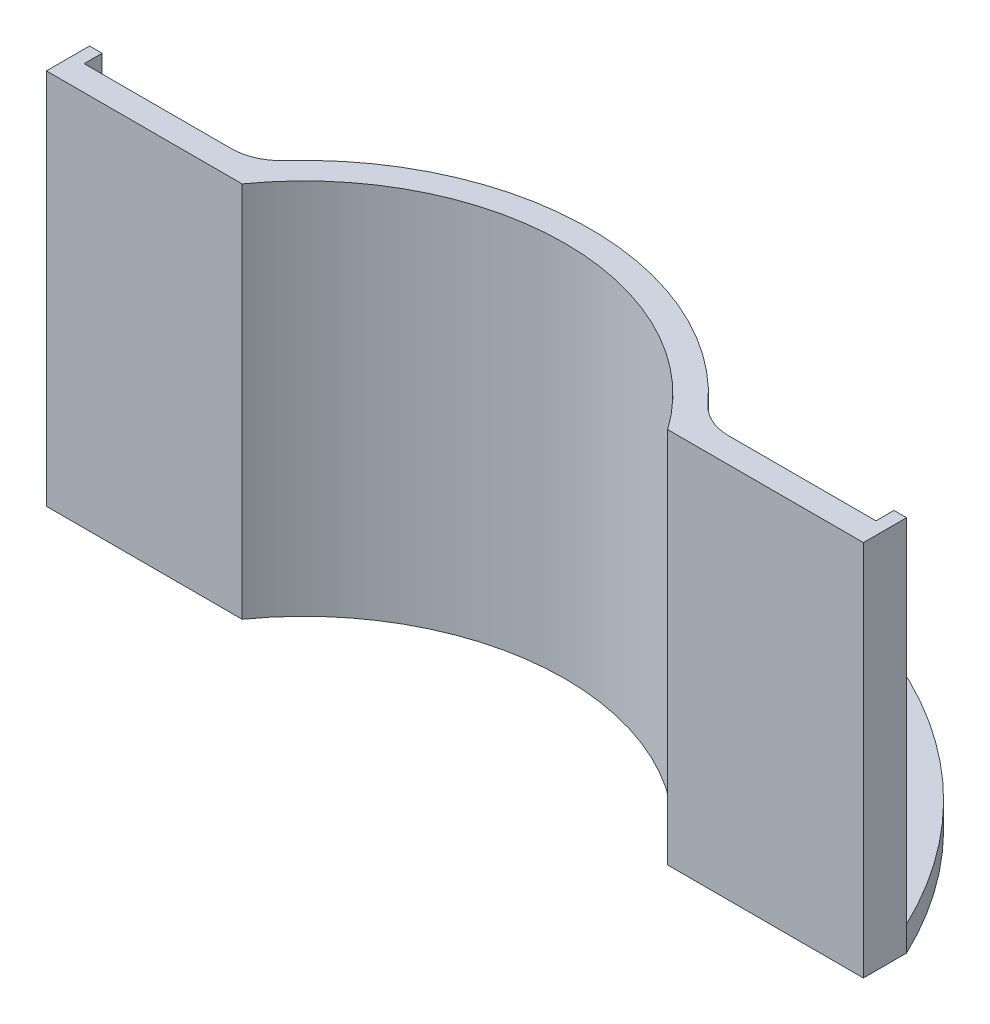
ISO-10303-21;
HEADER;
FILE_DESCRIPTION(('STEP AP214'),'2;1');
FILE_NAME('part.step','',(''),(''),'','','');
FILE_SCHEMA(('AUTOMOTIVE_DESIGN { 1 0 10303 214 1 1 1 1 }'));
ENDSEC;
DATA;
#1=APPLICATION_CONTEXT('core data for automotive mechanical design processes');
#2=APPLICATION_PROTOCOL_DEFINITION('international standard','automotive_design',2000,#1);
#3=PRODUCT_CONTEXT('',#1,'mechanical');
#4=PRODUCT('Part','Part','',(#3));
#5=PRODUCT_RELATED_PRODUCT_CATEGORY('part','',(#4));
#6=PRODUCT_DEFINITION_FORMATION('','',#4);
#7=PRODUCT_DEFINITION_CONTEXT('part definition',#1,'design');
#8=PRODUCT_DEFINITION('design','',#6,#7);
#9=PRODUCT_DEFINITION_SHAPE('','',#8);
#10=(LENGTH_UNIT() NAMED_UNIT(*) SI_UNIT(.MILLI.,.METRE.));
#11=(NAMED_UNIT(*) PLANE_ANGLE_UNIT() SI_UNIT($,.RADIAN.));
#12=(NAMED_UNIT(*) SI_UNIT($,.STERADIAN.) SOLID_ANGLE_UNIT());
#13=UNCERTAINTY_MEASURE_WITH_UNIT(LENGTH_MEASURE(1.E-05),#10,'distance_accuracy_value','');
#14=(GEOMETRIC_REPRESENTATION_CONTEXT(3) GLOBAL_UNCERTAINTY_ASSIGNED_CONTEXT((#13)) GLOBAL_UNIT_ASSIGNED_CONTEXT((#10,
#11,#12)) REPRESENTATION_CONTEXT('',''));
#15=CARTESIAN_POINT('',(0.,0.,0.));
#16=DIRECTION('',(0.,0.,1.));
#17=DIRECTION('',(1.,0.,0.));
#18=AXIS2_PLACEMENT_3D('',#15,#16,#17);
#19=CARTESIAN_POINT('',(0.,38.1,0.));
#20=DIRECTION('',(0.,1.,0.));
#21=DIRECTION('',(0.,0.,1.));
#22=AXIS2_PLACEMENT_3D('',#19,#20,#21);
#23=PLANE('',#22);
#24=DIRECTION('',(0.,0.,1.));
#25=VECTOR('',#24,1.);
#26=CARTESIAN_POINT('',(-40.005,38.1,12.0650000000002));
#27=LINE('',#26,#25);
#28=CARTESIAN_POINT('',(-40.005,38.1,10.2461896076332));
#29=VERTEX_POINT('',#28);
#30=CARTESIAN_POINT('',(-40.005,38.1,12.0650000000002));
#31=VERTEX_POINT('',#30);
#32=EDGE_CURVE('E320',#29,#31,#27,.T.);
#33=ORIENTED_EDGE('',*,*,#32,.F.);
#34=DIRECTION('',(1.,0.,0.));
#35=VECTOR('',#34,1.);
#36=CARTESIAN_POINT('',(-41.275,38.1,10.2461896076332));
#37=LINE('',#36,#35);
#38=CARTESIAN_POINT('',(-41.275,38.1,10.2461896076332));
#39=VERTEX_POINT('',#38);
#40=EDGE_CURVE('E150',#39,#29,#37,.T.);
#41=ORIENTED_EDGE('',*,*,#40,.F.);
#42=DIRECTION('',(0.,0.,1.));
#43=VECTOR('',#42,1.);
#44=CARTESIAN_POINT('',(-41.275,38.1,14.605));
#45=LINE('',#44,#43);
#46=CARTESIAN_POINT('',(-41.275,38.1,14.605));
#47=VERTEX_POINT('',#46);
#48=EDGE_CURVE('E144',#39,#47,#45,.T.);
#49=ORIENTED_EDGE('',*,*,#48,.T.);
#50=DIRECTION('',(1.,0.,0.));
#51=VECTOR('',#50,1.);
#52=CARTESIAN_POINT('',(41.275,38.1,14.605));
#53=LINE('',#52,#51);
#54=CARTESIAN_POINT('',(-21.498759411882,38.1,14.605));
#55=VERTEX_POINT('',#54);
#56=EDGE_CURVE('E147',#47,#55,#53,.T.);
#57=ORIENTED_EDGE('',*,*,#56,.T.);
#58=CARTESIAN_POINT('',(3.89345260586563E-13,38.1,29.845));
#59=DIRECTION('',(0.,1.,0.));
#60=DIRECTION('',(0.,0.,1.));
#61=AXIS2_PLACEMENT_3D('',#58,#59,#60);
#62=CIRCLE('',#61,26.3524999999997);
#63=CARTESIAN_POINT('',(21.498759411882,38.1,14.605));
#64=VERTEX_POINT('',#63);
#65=EDGE_CURVE('E202',#64,#55,#62,.T.);
#66=ORIENTED_EDGE('',*,*,#65,.F.);
#67=CARTESIAN_POINT('',(41.275,38.1,14.605));
#68=VERTEX_POINT('',#67);
#69=EDGE_CURVE('E165',#64,#68,#53,.T.);
#70=ORIENTED_EDGE('',*,*,#69,.T.);
#71=DIRECTION('',(0.,0.,-1.));
#72=VECTOR('',#71,1.);
#73=CARTESIAN_POINT('',(41.275,38.1,14.605));
#74=LINE('',#73,#72);
#75=CARTESIAN_POINT('',(41.275,38.1,10.2461896076315));
#76=VERTEX_POINT('',#75);
#77=EDGE_CURVE('E154',#68,#76,#74,.T.);
#78=ORIENTED_EDGE('',*,*,#77,.T.);
#79=DIRECTION('',(1.,0.,-1.32494627692717E-12));
#80=VECTOR('',#79,1.);
#81=CARTESIAN_POINT('',(41.275,38.1,10.2461896076315));
#82=LINE('',#81,#80);
#83=CARTESIAN_POINT('',(40.005,38.1,10.2461896076332));
#84=VERTEX_POINT('',#83);
#85=EDGE_CURVE('E298',#84,#76,#82,.T.);
#86=ORIENTED_EDGE('',*,*,#85,.F.);
#87=DIRECTION('',(0.,0.,-1.));
#88=VECTOR('',#87,1.);
#89=CARTESIAN_POINT('',(40.005,38.1,10.2461896076332));
#90=LINE('',#89,#88);
#91=CARTESIAN_POINT('',(40.005,38.1,12.0649999999997));
#92=VERTEX_POINT('',#91);
#93=EDGE_CURVE('E303',#92,#84,#90,.T.);
#94=ORIENTED_EDGE('',*,*,#93,.F.);
#95=DIRECTION('',(-1.,0.,0.));
#96=VECTOR('',#95,1.);
#97=CARTESIAN_POINT('',(2.69374875231912E-13,38.1,12.065));
#98=LINE('',#97,#96);
#99=CARTESIAN_POINT('',(25.1306815715375,38.1,12.0649999999998));
#100=VERTEX_POINT('',#99);
#101=EDGE_CURVE('E79',#92,#100,#98,.T.);
#102=ORIENTED_EDGE('',*,*,#101,.T.);
#103=CARTESIAN_POINT('',(25.1306815715374,38.1,6.98499999999982));
#104=DIRECTION('',(0.,1.,0.));
#105=DIRECTION('',(0.,0.,-1.));
#106=AXIS2_PLACEMENT_3D('',#103,#104,#105);
#107=CIRCLE('',#106,5.08);
#108=CARTESIAN_POINT('',(21.3728226449525,38.1,10.4033177570092));
#109=VERTEX_POINT('',#108);
#110=EDGE_CURVE('E273',#109,#100,#107,.T.);
#111=ORIENTED_EDGE('',*,*,#110,.F.);
#112=CARTESIAN_POINT('',(3.9265862473015E-13,38.1,29.845));
#113=DIRECTION('',(0.,-1.,0.));
#114=DIRECTION('',(0.,0.,-1.));
#115=AXIS2_PLACEMENT_3D('',#112,#113,#114);
#116=CIRCLE('',#115,28.8925);
#117=CARTESIAN_POINT('',(-21.3728226449519,38.1,10.4033177570095));
#118=VERTEX_POINT('',#117);
#119=EDGE_CURVE('E251',#118,#109,#116,.T.);
#120=ORIENTED_EDGE('',*,*,#119,.F.);
#121=CARTESIAN_POINT('',(-25.130681571537,38.1,6.98500000000016));
#122=DIRECTION('',(0.,1.,0.));
#123=DIRECTION('',(0.,0.,-1.));
#124=AXIS2_PLACEMENT_3D('',#121,#122,#123);
#125=CIRCLE('',#124,5.08);
#126=CARTESIAN_POINT('',(-25.130681571537,38.1,12.0650000000002));
#127=VERTEX_POINT('',#126);
#128=EDGE_CURVE('E271',#127,#118,#125,.T.);
#129=ORIENTED_EDGE('',*,*,#128,.F.);
#130=EDGE_CURVE('E91',#127,#31,#98,.T.);
#131=ORIENTED_EDGE('',*,*,#130,.T.);
#132=EDGE_LOOP('',(#33,#41,#49,#57,#66,#70,#78,#86,#94,#102,#111,#120,#129,#131));
#133=FACE_BOUND('',#132,.T.);
#134=ADVANCED_FACE('F76',(#133),#23,.T.);
#135=CARTESIAN_POINT('',(41.275,38.1,-14.605));
#136=DIRECTION('',(0.,0.,1.));
#137=DIRECTION('',(1.,0.,0.));
#138=AXIS2_PLACEMENT_3D('',#135,#136,#137);
#139=PLANE('',#138);
#140=DIRECTION('',(-1.,0.,0.));
#141=VECTOR('',#140,1.);
#142=CARTESIAN_POINT('',(41.275,2.54,-14.605));
#143=LINE('',#142,#141);
#144=CARTESIAN_POINT('',(10.5800044327009,2.54,-14.6050000000002));
#145=VERTEX_POINT('',#144);
#146=CARTESIAN_POINT('',(-10.5800044327009,2.54,-14.605));
#147=VERTEX_POINT('',#146);
#148=EDGE_CURVE('E222',#145,#147,#143,.T.);
#149=ORIENTED_EDGE('',*,*,#148,.F.);
#150=DIRECTION('',(0.,1.,0.));
#151=VECTOR('',#150,1.);
#152=CARTESIAN_POINT('',(10.5800044327009,0.,-14.605));
#153=LINE('',#152,#151);
#154=CARTESIAN_POINT('',(10.5800044327009,0.,-14.605));
#155=VERTEX_POINT('',#154);
#156=EDGE_CURVE('E205',#155,#145,#153,.T.);
#157=ORIENTED_EDGE('',*,*,#156,.F.);
#158=DIRECTION('',(-1.,0.,0.));
#159=VECTOR('',#158,1.);
#160=CARTESIAN_POINT('',(41.275,0.,-14.605));
#161=LINE('',#160,#159);
#162=CARTESIAN_POINT('',(-10.5800044327009,0.,-14.605));
#163=VERTEX_POINT('',#162);
#164=EDGE_CURVE('E183',#155,#163,#161,.T.);
#165=ORIENTED_EDGE('',*,*,#164,.T.);
#166=DIRECTION('',(0.,1.,0.));
#167=VECTOR('',#166,1.);
#168=CARTESIAN_POINT('',(-10.5800044327009,0.,-14.605));
#169=LINE('',#168,#167);
#170=EDGE_CURVE('E186',#163,#147,#169,.T.);
#171=ORIENTED_EDGE('',*,*,#170,.T.);
#172=EDGE_LOOP('',(#149,#157,#165,#171));
#173=FACE_BOUND('',#172,.T.);
#174=ADVANCED_FACE('F220',(#173),#139,.F.);
#175=CARTESIAN_POINT('',(3.89345260586563E-13,0.,29.845));
#176=DIRECTION('',(0.,1.,0.));
#177=DIRECTION('',(0.,0.,1.));
#178=AXIS2_PLACEMENT_3D('',#175,#176,#177);
#179=CYLINDRICAL_SURFACE('',#178,45.6917825631259);
#180=DIRECTION('',(0.,1.,0.));
#181=VECTOR('',#180,1.);
#182=CARTESIAN_POINT('',(-41.275,0.,10.2461896076332));
#183=LINE('',#182,#181);
#184=CARTESIAN_POINT('',(-41.275,0.,10.2461896076332));
#185=VERTEX_POINT('',#184);
#186=CARTESIAN_POINT('',(-41.275,2.54,10.2461896076332));
#187=VERTEX_POINT('',#186);
#188=EDGE_CURVE('E197',#185,#187,#183,.T.);
#189=ORIENTED_EDGE('',*,*,#188,.T.);
#190=CARTESIAN_POINT('',(3.89345260586563E-13,2.54,29.845));
#191=DIRECTION('',(0.,1.,0.));
#192=DIRECTION('',(0.,0.,1.));
#193=AXIS2_PLACEMENT_3D('',#190,#191,#192);
#194=CIRCLE('',#193,45.6917825631259);
#195=EDGE_CURVE('E248',#187,#147,#194,.F.);
#196=ORIENTED_EDGE('',*,*,#195,.T.);
#197=ORIENTED_EDGE('',*,*,#170,.F.);
#198=CARTESIAN_POINT('',(3.89345260586563E-13,0.,29.845));
#199=DIRECTION('',(0.,1.,0.));
#200=DIRECTION('',(0.,0.,1.));
#201=AXIS2_PLACEMENT_3D('',#198,#199,#200);
#202=CIRCLE('',#201,45.6917825631259);
#203=EDGE_CURVE('E200',#163,#185,#202,.T.);
#204=ORIENTED_EDGE('',*,*,#203,.T.);
#205=EDGE_LOOP('',(#189,#196,#197,#204));
#206=FACE_BOUND('',#205,.T.);
#207=ADVANCED_FACE('F229',(#206),#179,.T.);
#208=CARTESIAN_POINT('',(3.89345260586563E-13,0.,29.845));
#209=DIRECTION('',(0.,1.,0.));
#210=DIRECTION('',(0.,0.,1.));
#211=AXIS2_PLACEMENT_3D('',#208,#209,#210);
#212=CYLINDRICAL_SURFACE('',#211,45.6917825631259);
#213=ORIENTED_EDGE('',*,*,#156,.T.);
#214=CARTESIAN_POINT('',(3.89345260586563E-13,2.54,29.845));
#215=DIRECTION('',(0.,1.,0.));
#216=DIRECTION('',(0.,0.,1.));
#217=AXIS2_PLACEMENT_3D('',#214,#215,#216);
#218=CIRCLE('',#217,45.6917825631259);
#219=CARTESIAN_POINT('',(41.275,2.54,10.2461896076315));
#220=VERTEX_POINT('',#219);
#221=EDGE_CURVE('E213',#145,#220,#218,.F.);
#222=ORIENTED_EDGE('',*,*,#221,.T.);
#223=DIRECTION('',(0.,1.,0.));
#224=VECTOR('',#223,1.);
#225=CARTESIAN_POINT('',(41.275,0.,10.2461896076315));
#226=LINE('',#225,#224);
#227=CARTESIAN_POINT('',(41.275,0.,10.2461896076315));
#228=VERTEX_POINT('',#227);
#229=EDGE_CURVE('E120',#228,#220,#226,.T.);
#230=ORIENTED_EDGE('',*,*,#229,.F.);
#231=CARTESIAN_POINT('',(3.89345260586563E-13,0.,29.845));
#232=DIRECTION('',(0.,1.,0.));
#233=DIRECTION('',(0.,0.,1.));
#234=AXIS2_PLACEMENT_3D('',#231,#232,#233);
#235=CIRCLE('',#234,45.6917825631259);
#236=EDGE_CURVE('E114',#228,#155,#235,.T.);
#237=ORIENTED_EDGE('',*,*,#236,.T.);
#238=EDGE_LOOP('',(#213,#222,#230,#237));
#239=FACE_BOUND('',#238,.T.);
#240=ADVANCED_FACE('F210',(#239),#212,.T.);
#241=CARTESIAN_POINT('',(-41.275,38.1,14.605));
#242=DIRECTION('',(1.,0.,0.));
#243=DIRECTION('',(0.,0.,-1.));
#244=AXIS2_PLACEMENT_3D('',#241,#242,#243);
#245=PLANE('',#244);
#246=ORIENTED_EDGE('',*,*,#188,.F.);
#247=DIRECTION('',(0.,0.,1.));
#248=VECTOR('',#247,1.);
#249=CARTESIAN_POINT('',(-41.275,0.,14.605));
#250=LINE('',#249,#248);
#251=CARTESIAN_POINT('',(-41.275,0.,14.605));
#252=VERTEX_POINT('',#251);
#253=EDGE_CURVE('E169',#185,#252,#250,.T.);
#254=ORIENTED_EDGE('',*,*,#253,.T.);
#255=DIRECTION('',(0.,-1.,0.));
#256=VECTOR('',#255,1.);
#257=CARTESIAN_POINT('',(-41.275,38.1,14.605));
#258=LINE('',#257,#256);
#259=EDGE_CURVE('E161',#47,#252,#258,.T.);
#260=ORIENTED_EDGE('',*,*,#259,.F.);
#261=ORIENTED_EDGE('',*,*,#48,.F.);
#262=DIRECTION('',(0.,-1.,0.));
#263=VECTOR('',#262,1.);
#264=CARTESIAN_POINT('',(-41.275,38.1,10.2461896076332));
#265=LINE('',#264,#263);
#266=EDGE_CURVE('E233',#39,#187,#265,.T.);
#267=ORIENTED_EDGE('',*,*,#266,.T.);
#268=EDGE_LOOP('',(#246,#254,#260,#261,#267));
#269=FACE_BOUND('',#268,.T.);
#270=ADVANCED_FACE('F167',(#269),#245,.F.);
#271=CARTESIAN_POINT('',(41.275,38.1,14.605));
#272=DIRECTION('',(0.,0.,-1.));
#273=DIRECTION('',(-1.,0.,0.));
#274=AXIS2_PLACEMENT_3D('',#271,#272,#273);
#275=PLANE('',#274);
#276=DIRECTION('',(1.,0.,0.));
#277=VECTOR('',#276,1.);
#278=CARTESIAN_POINT('',(41.275,0.,14.605));
#279=LINE('',#278,#277);
#280=CARTESIAN_POINT('',(-21.4987594118816,0.,14.605));
#281=VERTEX_POINT('',#280);
#282=EDGE_CURVE('E174',#252,#281,#279,.T.);
#283=ORIENTED_EDGE('',*,*,#282,.T.);
#284=DIRECTION('',(0.,1.,0.));
#285=VECTOR('',#284,1.);
#286=CARTESIAN_POINT('',(-21.498759411882,0.,14.605));
#287=LINE('',#286,#285);
#288=EDGE_CURVE('E163',#281,#55,#287,.T.);
#289=ORIENTED_EDGE('',*,*,#288,.T.);
#290=ORIENTED_EDGE('',*,*,#56,.F.);
#291=ORIENTED_EDGE('',*,*,#259,.T.);
#292=EDGE_LOOP('',(#283,#289,#290,#291));
#293=FACE_BOUND('',#292,.T.);
#294=ADVANCED_FACE('F160',(#293),#275,.F.);
#295=CARTESIAN_POINT('',(41.275,38.1,14.605));
#296=DIRECTION('',(-1.,0.,0.));
#297=DIRECTION('',(0.,0.,1.));
#298=AXIS2_PLACEMENT_3D('',#295,#296,#297);
#299=PLANE('',#298);
#300=ORIENTED_EDGE('',*,*,#229,.T.);
#301=DIRECTION('',(0.,-1.,0.));
#302=VECTOR('',#301,1.);
#303=CARTESIAN_POINT('',(41.275,38.1,10.2461896076315));
#304=LINE('',#303,#302);
#305=EDGE_CURVE('E291',#76,#220,#304,.T.);
#306=ORIENTED_EDGE('',*,*,#305,.F.);
#307=ORIENTED_EDGE('',*,*,#77,.F.);
#308=DIRECTION('',(0.,-1.,0.));
#309=VECTOR('',#308,1.);
#310=CARTESIAN_POINT('',(41.275,38.1,14.605));
#311=LINE('',#310,#309);
#312=CARTESIAN_POINT('',(41.275,0.,14.605));
#313=VERTEX_POINT('',#312);
#314=EDGE_CURVE('E172',#68,#313,#311,.T.);
#315=ORIENTED_EDGE('',*,*,#314,.T.);
#316=DIRECTION('',(0.,0.,-1.));
#317=VECTOR('',#316,1.);
#318=CARTESIAN_POINT('',(41.275,0.,14.605));
#319=LINE('',#318,#317);
#320=EDGE_CURVE('E182',#313,#228,#319,.T.);
#321=ORIENTED_EDGE('',*,*,#320,.T.);
#322=EDGE_LOOP('',(#300,#306,#307,#315,#321));
#323=FACE_BOUND('',#322,.T.);
#324=ADVANCED_FACE('F289',(#323),#299,.F.);
#325=CARTESIAN_POINT('',(0.,0.,0.));
#326=DIRECTION('',(0.,1.,0.));
#327=DIRECTION('',(0.,0.,1.));
#328=AXIS2_PLACEMENT_3D('',#325,#326,#327);
#329=PLANE('',#328);
#330=CARTESIAN_POINT('',(21.498759411882,0.,14.605));
#331=VERTEX_POINT('',#330);
#332=EDGE_CURVE('E190',#331,#313,#279,.T.);
#333=ORIENTED_EDGE('',*,*,#332,.F.);
#334=CARTESIAN_POINT('',(3.89345260586563E-13,0.,29.845));
#335=DIRECTION('',(0.,1.,0.));
#336=DIRECTION('',(0.,0.,1.));
#337=AXIS2_PLACEMENT_3D('',#334,#335,#336);
#338=CIRCLE('',#337,26.3524999999997);
#339=EDGE_CURVE('E196',#331,#281,#338,.T.);
#340=ORIENTED_EDGE('',*,*,#339,.T.);
#341=ORIENTED_EDGE('',*,*,#282,.F.);
#342=ORIENTED_EDGE('',*,*,#253,.F.);
#343=ORIENTED_EDGE('',*,*,#203,.F.);
#344=ORIENTED_EDGE('',*,*,#164,.F.);
#345=ORIENTED_EDGE('',*,*,#236,.F.);
#346=ORIENTED_EDGE('',*,*,#320,.F.);
#347=EDGE_LOOP('',(#333,#340,#341,#342,#343,#344,#345,#346));
#348=FACE_BOUND('',#347,.T.);
#349=ADVANCED_FACE('F226',(#348),#329,.F.);
#350=ORIENTED_EDGE('',*,*,#69,.F.);
#351=DIRECTION('',(0.,1.,0.));
#352=VECTOR('',#351,1.);
#353=CARTESIAN_POINT('',(21.498759411882,0.,14.605));
#354=LINE('',#353,#352);
#355=EDGE_CURVE('E100',#331,#64,#354,.T.);
#356=ORIENTED_EDGE('',*,*,#355,.F.);
#357=ORIENTED_EDGE('',*,*,#332,.T.);
#358=ORIENTED_EDGE('',*,*,#314,.F.);
#359=EDGE_LOOP('',(#350,#356,#357,#358));
#360=FACE_BOUND('',#359,.T.);
#361=ADVANCED_FACE('F286',(#360),#275,.F.);
#362=CARTESIAN_POINT('',(3.89345260586563E-13,0.,29.845));
#363=DIRECTION('',(0.,1.,0.));
#364=DIRECTION('',(0.,0.,1.));
#365=AXIS2_PLACEMENT_3D('',#362,#363,#364);
#366=CYLINDRICAL_SURFACE('',#365,26.3524999999997);
#367=ORIENTED_EDGE('',*,*,#65,.T.);
#368=ORIENTED_EDGE('',*,*,#288,.F.);
#369=ORIENTED_EDGE('',*,*,#339,.F.);
#370=ORIENTED_EDGE('',*,*,#355,.T.);
#371=EDGE_LOOP('',(#367,#368,#369,#370));
#372=FACE_BOUND('',#371,.T.);
#373=ADVANCED_FACE('F405',(#372),#366,.F.);
#374=CARTESIAN_POINT('',(3.92501661776159E-13,2.54,29.845));
#375=DIRECTION('',(0.,1.,0.));
#376=DIRECTION('',(0.,0.,-1.));
#377=AXIS2_PLACEMENT_3D('',#374,#375,#376);
#378=PLANE('',#377);
#379=DIRECTION('',(0.,0.,1.));
#380=VECTOR('',#379,1.);
#381=CARTESIAN_POINT('',(-40.005,2.54,12.0650000000002));
#382=LINE('',#381,#380);
#383=CARTESIAN_POINT('',(-40.005,2.54,10.2461896076332));
#384=VERTEX_POINT('',#383);
#385=CARTESIAN_POINT('',(-40.005,2.54,12.0650000000002));
#386=VERTEX_POINT('',#385);
#387=EDGE_CURVE('E318',#384,#386,#382,.T.);
#388=ORIENTED_EDGE('',*,*,#387,.T.);
#389=DIRECTION('',(-1.,0.,0.));
#390=VECTOR('',#389,1.);
#391=CARTESIAN_POINT('',(2.69374875231912E-13,2.54,12.065));
#392=LINE('',#391,#390);
#393=CARTESIAN_POINT('',(-25.1306815715369,2.54,12.0650000000002));
#394=VERTEX_POINT('',#393);
#395=EDGE_CURVE('E84',#394,#386,#392,.T.);
#396=ORIENTED_EDGE('',*,*,#395,.F.);
#397=CARTESIAN_POINT('',(-25.130681571537,2.54,6.98500000000016));
#398=DIRECTION('',(0.,1.,0.));
#399=DIRECTION('',(0.,0.,-1.));
#400=AXIS2_PLACEMENT_3D('',#397,#398,#399);
#401=CIRCLE('',#400,5.08);
#402=CARTESIAN_POINT('',(-21.3728226449519,2.54,10.4033177570095));
#403=VERTEX_POINT('',#402);
#404=EDGE_CURVE('E259',#403,#394,#401,.F.);
#405=ORIENTED_EDGE('',*,*,#404,.F.);
#406=CARTESIAN_POINT('',(3.9265862473015E-13,2.54,29.845));
#407=DIRECTION('',(0.,-1.,0.));
#408=DIRECTION('',(0.,0.,-1.));
#409=AXIS2_PLACEMENT_3D('',#406,#407,#408);
#410=CIRCLE('',#409,28.8925);
#411=CARTESIAN_POINT('',(21.3728226449525,2.54,10.4033177570092));
#412=VERTEX_POINT('',#411);
#413=EDGE_CURVE('E250',#403,#412,#410,.T.);
#414=ORIENTED_EDGE('',*,*,#413,.T.);
#415=CARTESIAN_POINT('',(25.1306815715374,2.54,6.98499999999982));
#416=DIRECTION('',(0.,1.,0.));
#417=DIRECTION('',(0.,0.,-1.));
#418=AXIS2_PLACEMENT_3D('',#415,#416,#417);
#419=CIRCLE('',#418,5.08);
#420=CARTESIAN_POINT('',(25.1306815715375,2.54,12.0649999999998));
#421=VERTEX_POINT('',#420);
#422=EDGE_CURVE('E262',#421,#412,#419,.F.);
#423=ORIENTED_EDGE('',*,*,#422,.F.);
#424=CARTESIAN_POINT('',(40.005,2.54,12.0649999999997));
#425=VERTEX_POINT('',#424);
#426=EDGE_CURVE('E12',#425,#421,#392,.T.);
#427=ORIENTED_EDGE('',*,*,#426,.F.);
#428=DIRECTION('',(0.,0.,-1.));
#429=VECTOR('',#428,1.);
#430=CARTESIAN_POINT('',(40.005,2.54,10.2461896076332));
#431=LINE('',#430,#429);
#432=CARTESIAN_POINT('',(40.005,2.54,10.2461896076332));
#433=VERTEX_POINT('',#432);
#434=EDGE_CURVE('E374',#425,#433,#431,.T.);
#435=ORIENTED_EDGE('',*,*,#434,.T.);
#436=DIRECTION('',(1.,0.,-1.32494627692717E-12));
#437=VECTOR('',#436,1.);
#438=CARTESIAN_POINT('',(41.275,2.54,10.2461896076315));
#439=LINE('',#438,#437);
#440=EDGE_CURVE('E306',#433,#220,#439,.T.);
#441=ORIENTED_EDGE('',*,*,#440,.T.);
#442=ORIENTED_EDGE('',*,*,#221,.F.);
#443=ORIENTED_EDGE('',*,*,#148,.T.);
#444=ORIENTED_EDGE('',*,*,#195,.F.);
#445=DIRECTION('',(1.,0.,0.));
#446=VECTOR('',#445,1.);
#447=CARTESIAN_POINT('',(-41.275,2.54,10.2461896076332));
#448=LINE('',#447,#446);
#449=EDGE_CURVE('E376',#187,#384,#448,.T.);
#450=ORIENTED_EDGE('',*,*,#449,.T.);
#451=EDGE_LOOP('',(#388,#396,#405,#414,#423,#427,#435,#441,#442,#443,#444,#450));
#452=FACE_BOUND('',#451,.T.);
#453=ADVANCED_FACE('F383',(#452),#378,.T.);
#454=CARTESIAN_POINT('',(2.69374875231912E-13,38.1,12.065));
#455=DIRECTION('',(0.,0.,1.));
#456=DIRECTION('',(1.,0.,0.));
#457=AXIS2_PLACEMENT_3D('',#454,#455,#456);
#458=PLANE('',#457);
#459=ORIENTED_EDGE('',*,*,#395,.T.);
#460=DIRECTION('',(0.,-1.,0.));
#461=VECTOR('',#460,1.);
#462=CARTESIAN_POINT('',(-40.005,38.1,12.0650000000002));
#463=LINE('',#462,#461);
#464=EDGE_CURVE('E243',#31,#386,#463,.T.);
#465=ORIENTED_EDGE('',*,*,#464,.F.);
#466=ORIENTED_EDGE('',*,*,#130,.F.);
#467=DIRECTION('',(0.,-1.,0.));
#468=VECTOR('',#467,1.);
#469=CARTESIAN_POINT('',(-25.1306815715369,38.1,12.0650000000002));
#470=LINE('',#469,#468);
#471=EDGE_CURVE('E178',#394,#127,#470,.F.);
#472=ORIENTED_EDGE('',*,*,#471,.F.);
#473=EDGE_LOOP('',(#459,#465,#466,#472));
#474=FACE_BOUND('',#473,.T.);
#475=ADVANCED_FACE('F324',(#474),#458,.F.);
#476=ORIENTED_EDGE('',*,*,#101,.F.);
#477=DIRECTION('',(0.,-1.,0.));
#478=VECTOR('',#477,1.);
#479=CARTESIAN_POINT('',(40.005,38.1,12.0649999999997));
#480=LINE('',#479,#478);
#481=EDGE_CURVE('E301',#92,#425,#480,.T.);
#482=ORIENTED_EDGE('',*,*,#481,.T.);
#483=ORIENTED_EDGE('',*,*,#426,.T.);
#484=DIRECTION('',(0.,-1.,0.));
#485=VECTOR('',#484,1.);
#486=CARTESIAN_POINT('',(25.1306815715375,38.1,12.0649999999998));
#487=LINE('',#486,#485);
#488=EDGE_CURVE('E254',#100,#421,#487,.T.);
#489=ORIENTED_EDGE('',*,*,#488,.F.);
#490=EDGE_LOOP('',(#476,#482,#483,#489));
#491=FACE_BOUND('',#490,.T.);
#492=ADVANCED_FACE('F369',(#491),#458,.F.);
#493=CARTESIAN_POINT('',(3.9265862473015E-13,38.1,29.845));
#494=DIRECTION('',(0.,-1.,0.));
#495=DIRECTION('',(0.,0.,1.));
#496=AXIS2_PLACEMENT_3D('',#493,#494,#495);
#497=CYLINDRICAL_SURFACE('',#496,28.8925);
#498=ORIENTED_EDGE('',*,*,#413,.F.);
#499=DIRECTION('',(0.,-1.,0.));
#500=VECTOR('',#499,1.);
#501=CARTESIAN_POINT('',(-21.3728226449519,38.1,10.4033177570095));
#502=LINE('',#501,#500);
#503=EDGE_CURVE('E265',#118,#403,#502,.T.);
#504=ORIENTED_EDGE('',*,*,#503,.F.);
#505=ORIENTED_EDGE('',*,*,#119,.T.);
#506=DIRECTION('',(0.,-1.,0.));
#507=VECTOR('',#506,1.);
#508=CARTESIAN_POINT('',(21.3728226449525,38.1,10.4033177570092));
#509=LINE('',#508,#507);
#510=EDGE_CURVE('E268',#412,#109,#509,.F.);
#511=ORIENTED_EDGE('',*,*,#510,.F.);
#512=EDGE_LOOP('',(#498,#504,#505,#511));
#513=FACE_BOUND('',#512,.T.);
#514=ADVANCED_FACE('F365',(#513),#497,.T.);
#515=CARTESIAN_POINT('',(25.1306815715374,38.1,6.98499999999982));
#516=DIRECTION('',(0.,-1.,0.));
#517=DIRECTION('',(0.,0.,1.));
#518=AXIS2_PLACEMENT_3D('',#515,#516,#517);
#519=CYLINDRICAL_SURFACE('',#518,5.08);
#520=ORIENTED_EDGE('',*,*,#110,.T.);
#521=ORIENTED_EDGE('',*,*,#488,.T.);
#522=ORIENTED_EDGE('',*,*,#422,.T.);
#523=ORIENTED_EDGE('',*,*,#510,.T.);
#524=EDGE_LOOP('',(#520,#521,#522,#523));
#525=FACE_BOUND('',#524,.T.);
#526=ADVANCED_FACE('F359',(#525),#519,.F.);
#527=CARTESIAN_POINT('',(-25.130681571537,38.1,6.98500000000016));
#528=DIRECTION('',(0.,-1.,0.));
#529=DIRECTION('',(0.,0.,1.));
#530=AXIS2_PLACEMENT_3D('',#527,#528,#529);
#531=CYLINDRICAL_SURFACE('',#530,5.08);
#532=ORIENTED_EDGE('',*,*,#128,.T.);
#533=ORIENTED_EDGE('',*,*,#503,.T.);
#534=ORIENTED_EDGE('',*,*,#404,.T.);
#535=ORIENTED_EDGE('',*,*,#471,.T.);
#536=EDGE_LOOP('',(#532,#533,#534,#535));
#537=FACE_BOUND('',#536,.T.);
#538=ADVANCED_FACE('F440',(#537),#531,.F.);
#539=CARTESIAN_POINT('',(-41.275,38.1,10.2461896076332));
#540=DIRECTION('',(0.,0.,-1.));
#541=DIRECTION('',(-1.,0.,0.));
#542=AXIS2_PLACEMENT_3D('',#539,#540,#541);
#543=PLANE('',#542);
#544=ORIENTED_EDGE('',*,*,#449,.F.);
#545=ORIENTED_EDGE('',*,*,#266,.F.);
#546=ORIENTED_EDGE('',*,*,#40,.T.);
#547=DIRECTION('',(0.,-1.,0.));
#548=VECTOR('',#547,1.);
#549=CARTESIAN_POINT('',(-40.005,38.1,10.2461896076332));
#550=LINE('',#549,#548);
#551=EDGE_CURVE('E239',#29,#384,#550,.T.);
#552=ORIENTED_EDGE('',*,*,#551,.T.);
#553=EDGE_LOOP('',(#544,#545,#546,#552));
#554=FACE_BOUND('',#553,.T.);
#555=ADVANCED_FACE('F382',(#554),#543,.T.);
#556=CARTESIAN_POINT('',(-40.005,38.1,12.0650000000002));
#557=DIRECTION('',(1.,0.,0.));
#558=DIRECTION('',(0.,0.,-1.));
#559=AXIS2_PLACEMENT_3D('',#556,#557,#558);
#560=PLANE('',#559);
#561=ORIENTED_EDGE('',*,*,#387,.F.);
#562=ORIENTED_EDGE('',*,*,#551,.F.);
#563=ORIENTED_EDGE('',*,*,#32,.T.);
#564=ORIENTED_EDGE('',*,*,#464,.T.);
#565=EDGE_LOOP('',(#561,#562,#563,#564));
#566=FACE_BOUND('',#565,.T.);
#567=ADVANCED_FACE('F315',(#566),#560,.T.);
#568=CARTESIAN_POINT('',(40.005,38.1,10.2461896076332));
#569=DIRECTION('',(-1.,0.,0.));
#570=DIRECTION('',(0.,0.,1.));
#571=AXIS2_PLACEMENT_3D('',#568,#569,#570);
#572=PLANE('',#571);
#573=ORIENTED_EDGE('',*,*,#434,.F.);
#574=ORIENTED_EDGE('',*,*,#481,.F.);
#575=ORIENTED_EDGE('',*,*,#93,.T.);
#576=DIRECTION('',(0.,-1.,0.));
#577=VECTOR('',#576,1.);
#578=CARTESIAN_POINT('',(40.005,38.1,10.2461896076332));
#579=LINE('',#578,#577);
#580=EDGE_CURVE('E297',#84,#433,#579,.T.);
#581=ORIENTED_EDGE('',*,*,#580,.T.);
#582=EDGE_LOOP('',(#573,#574,#575,#581));
#583=FACE_BOUND('',#582,.T.);
#584=ADVANCED_FACE('F372',(#583),#572,.T.);
#585=CARTESIAN_POINT('',(41.275,38.1,10.2461896076315));
#586=DIRECTION('',(-1.32494627692717E-12,0.,-1.));
#587=DIRECTION('',(-1.,0.,1.32494627692717E-12));
#588=AXIS2_PLACEMENT_3D('',#585,#586,#587);
#589=PLANE('',#588);
#590=ORIENTED_EDGE('',*,*,#440,.F.);
#591=ORIENTED_EDGE('',*,*,#580,.F.);
#592=ORIENTED_EDGE('',*,*,#85,.T.);
#593=ORIENTED_EDGE('',*,*,#305,.T.);
#594=EDGE_LOOP('',(#590,#591,#592,#593));
#595=FACE_BOUND('',#594,.T.);
#596=ADVANCED_FACE('F384',(#595),#589,.T.);
#597=CLOSED_SHELL('',(#134,#174,#207,#240,#270,#294,#324,#349,#361,#373,#453,#475,#492,#514,
#526,#538,#555,#567,#584,#596));
#598=MANIFOLD_SOLID_BREP('B2',#597);
#599=ADVANCED_BREP_SHAPE_REPRESENTATION('',(#18,#598),#14);
#600=SHAPE_DEFINITION_REPRESENTATION(#9,#599);
ENDSEC;
END-ISO-10303-21;
